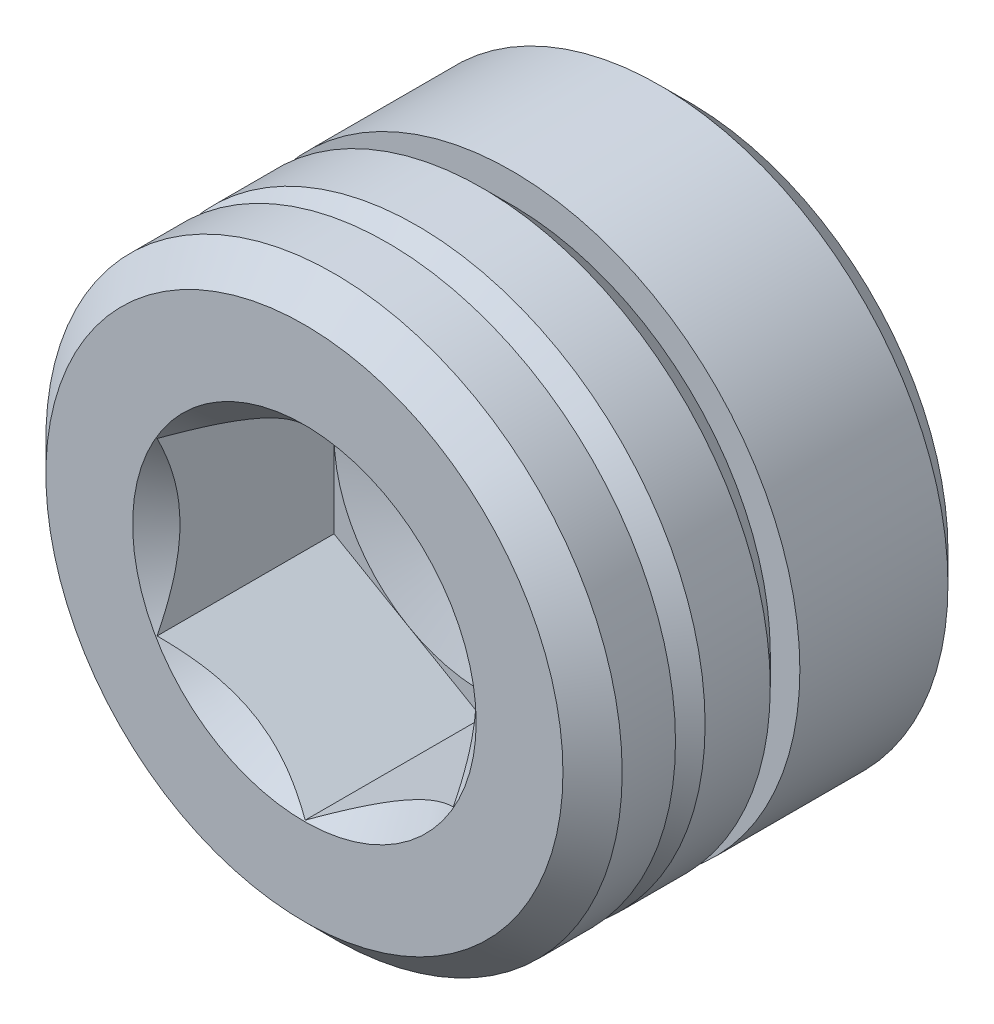
ISO-10303-21;
HEADER;
FILE_DESCRIPTION(('STEP AP214'),'2;1');
FILE_NAME('part.step','',(''),(''),'','','');
FILE_SCHEMA(('AUTOMOTIVE_DESIGN { 1 0 10303 214 1 1 1 1 }'));
ENDSEC;
DATA;
#1=APPLICATION_CONTEXT('core data for automotive mechanical design processes');
#2=APPLICATION_PROTOCOL_DEFINITION('international standard','automotive_design',2000,#1);
#3=PRODUCT_CONTEXT('',#1,'mechanical');
#4=PRODUCT('Part','Part','',(#3));
#5=PRODUCT_RELATED_PRODUCT_CATEGORY('part','',(#4));
#6=PRODUCT_DEFINITION_FORMATION('','',#4);
#7=PRODUCT_DEFINITION_CONTEXT('part definition',#1,'design');
#8=PRODUCT_DEFINITION('design','',#6,#7);
#9=PRODUCT_DEFINITION_SHAPE('','',#8);
#10=(LENGTH_UNIT() NAMED_UNIT(*) SI_UNIT(.MILLI.,.METRE.));
#11=(NAMED_UNIT(*) PLANE_ANGLE_UNIT() SI_UNIT($,.RADIAN.));
#12=(NAMED_UNIT(*) SI_UNIT($,.STERADIAN.) SOLID_ANGLE_UNIT());
#13=UNCERTAINTY_MEASURE_WITH_UNIT(LENGTH_MEASURE(1.E-05),#10,'distance_accuracy_value','');
#14=(GEOMETRIC_REPRESENTATION_CONTEXT(3) GLOBAL_UNCERTAINTY_ASSIGNED_CONTEXT((#13)) GLOBAL_UNIT_ASSIGNED_CONTEXT((#10,
#11,#12)) REPRESENTATION_CONTEXT('',''));
#15=CARTESIAN_POINT('',(0.,0.,0.));
#16=DIRECTION('',(0.,0.,1.));
#17=DIRECTION('',(1.,0.,0.));
#18=AXIS2_PLACEMENT_3D('',#15,#16,#17);
#19=CARTESIAN_POINT('',(0.,0.,-6.5));
#20=DIRECTION('',(0.,0.,1.));
#21=DIRECTION('',(1.,0.,0.));
#22=AXIS2_PLACEMENT_3D('',#19,#20,#21);
#23=CYLINDRICAL_SURFACE('',#22,4.865);
#24=CARTESIAN_POINT('',(0.,0.,-0.5));
#25=DIRECTION('',(0.,0.,1.));
#26=DIRECTION('',(1.,0.,0.));
#27=AXIS2_PLACEMENT_3D('',#24,#25,#26);
#28=CIRCLE('',#27,4.865);
#29=CARTESIAN_POINT('',(4.865,0.,-0.5));
#30=VERTEX_POINT('',#29);
#31=EDGE_CURVE('E42',#30,#30,#28,.T.);
#32=ORIENTED_EDGE('',*,*,#31,.F.);
#33=EDGE_LOOP('',(#32));
#34=FACE_BOUND('',#33,.T.);
#35=CARTESIAN_POINT('',(0.,0.,-1.4));
#36=DIRECTION('',(0.,0.,1.));
#37=DIRECTION('',(1.,0.,0.));
#38=AXIS2_PLACEMENT_3D('',#35,#36,#37);
#39=CIRCLE('',#38,4.865);
#40=CARTESIAN_POINT('',(4.865,0.,-1.4));
#41=VERTEX_POINT('',#40);
#42=EDGE_CURVE('E223',#41,#41,#39,.T.);
#43=ORIENTED_EDGE('',*,*,#42,.T.);
#44=EDGE_LOOP('',(#43));
#45=FACE_BOUND('',#44,.T.);
#46=ADVANCED_FACE('F34',(#34,#45),#23,.T.);
#47=CARTESIAN_POINT('',(0.,0.,0.));
#48=DIRECTION('',(0.,0.,-1.));
#49=DIRECTION('',(-1.,0.,0.));
#50=AXIS2_PLACEMENT_3D('',#47,#48,#49);
#51=PLANE('',#50);
#52=CARTESIAN_POINT('',(0.,0.,0.));
#53=DIRECTION('',(0.,0.,1.));
#54=DIRECTION('',(1.,0.,0.));
#55=AXIS2_PLACEMENT_3D('',#52,#53,#54);
#56=CIRCLE('',#55,2.9);
#57=CARTESIAN_POINT('',(2.9,0.,0.));
#58=VERTEX_POINT('',#57);
#59=EDGE_CURVE('E204',#58,#58,#56,.T.);
#60=ORIENTED_EDGE('',*,*,#59,.F.);
#61=EDGE_LOOP('',(#60));
#62=FACE_BOUND('',#61,.T.);
#63=CARTESIAN_POINT('',(0.,0.,0.));
#64=DIRECTION('',(0.,0.,1.));
#65=DIRECTION('',(1.,0.,0.));
#66=AXIS2_PLACEMENT_3D('',#63,#64,#65);
#67=CIRCLE('',#66,4.365);
#68=CARTESIAN_POINT('',(4.365,0.,0.));
#69=VERTEX_POINT('',#68);
#70=EDGE_CURVE('E11',#69,#69,#67,.T.);
#71=ORIENTED_EDGE('',*,*,#70,.T.);
#72=EDGE_LOOP('',(#71));
#73=FACE_BOUND('',#72,.T.);
#74=ADVANCED_FACE('F36',(#62,#73),#51,.F.);
#75=CARTESIAN_POINT('',(0.,0.,-0.5));
#76=DIRECTION('',(0.,0.,-1.));
#77=DIRECTION('',(-1.,0.,0.));
#78=AXIS2_PLACEMENT_3D('',#75,#76,#77);
#79=CONICAL_SURFACE('',#78,4.865,0.785398163397449);
#80=ORIENTED_EDGE('',*,*,#70,.F.);
#81=EDGE_LOOP('',(#80));
#82=FACE_BOUND('',#81,.T.);
#83=ORIENTED_EDGE('',*,*,#31,.T.);
#84=EDGE_LOOP('',(#83));
#85=FACE_BOUND('',#84,.T.);
#86=ADVANCED_FACE('F234',(#82,#85),#79,.T.);
#87=CARTESIAN_POINT('',(0.,4.865,-1.4));
#88=DIRECTION('',(0.,0.,-1.));
#89=DIRECTION('',(-1.,0.,0.));
#90=AXIS2_PLACEMENT_3D('',#87,#88,#89);
#91=PLANE('',#90);
#92=CARTESIAN_POINT('',(0.,0.,-1.4));
#93=DIRECTION('',(0.,0.,1.));
#94=DIRECTION('',(1.,0.,0.));
#95=AXIS2_PLACEMENT_3D('',#92,#93,#94);
#96=CIRCLE('',#95,4.365);
#97=CARTESIAN_POINT('',(4.365,0.,-1.4));
#98=VERTEX_POINT('',#97);
#99=EDGE_CURVE('E220',#98,#98,#96,.T.);
#100=ORIENTED_EDGE('',*,*,#99,.T.);
#101=EDGE_LOOP('',(#100));
#102=FACE_BOUND('',#101,.T.);
#103=ORIENTED_EDGE('',*,*,#42,.F.);
#104=EDGE_LOOP('',(#103));
#105=FACE_BOUND('',#104,.T.);
#106=ADVANCED_FACE('F243',(#102,#105),#91,.T.);
#107=CARTESIAN_POINT('',(0.,0.,-1.4));
#108=DIRECTION('',(0.,0.,-1.));
#109=DIRECTION('',(-1.,0.,0.));
#110=AXIS2_PLACEMENT_3D('',#107,#108,#109);
#111=CONICAL_SURFACE('',#110,4.365,0.785398163397449);
#112=CARTESIAN_POINT('',(0.,0.,-1.9));
#113=DIRECTION('',(0.,0.,1.));
#114=DIRECTION('',(1.,0.,0.));
#115=AXIS2_PLACEMENT_3D('',#112,#113,#114);
#116=CIRCLE('',#115,4.865);
#117=CARTESIAN_POINT('',(4.865,0.,-1.9));
#118=VERTEX_POINT('',#117);
#119=EDGE_CURVE('E217',#118,#118,#116,.T.);
#120=ORIENTED_EDGE('',*,*,#119,.T.);
#121=EDGE_LOOP('',(#120));
#122=FACE_BOUND('',#121,.T.);
#123=ORIENTED_EDGE('',*,*,#99,.F.);
#124=EDGE_LOOP('',(#123));
#125=FACE_BOUND('',#124,.T.);
#126=ADVANCED_FACE('F245',(#122,#125),#111,.T.);
#127=CARTESIAN_POINT('',(0.,0.,-3.));
#128=DIRECTION('',(0.,0.,1.));
#129=DIRECTION('',(1.,0.,0.));
#130=AXIS2_PLACEMENT_3D('',#127,#128,#129);
#131=CIRCLE('',#130,4.865);
#132=CARTESIAN_POINT('',(4.865,0.,-3.));
#133=VERTEX_POINT('',#132);
#134=EDGE_CURVE('E214',#133,#133,#131,.T.);
#135=ORIENTED_EDGE('',*,*,#134,.T.);
#136=EDGE_LOOP('',(#135));
#137=FACE_BOUND('',#136,.T.);
#138=ORIENTED_EDGE('',*,*,#119,.F.);
#139=EDGE_LOOP('',(#138));
#140=FACE_BOUND('',#139,.T.);
#141=ADVANCED_FACE('F239',(#137,#140),#23,.T.);
#142=CARTESIAN_POINT('',(0.,4.365,-3.5));
#143=DIRECTION('',(0.,0.,1.));
#144=DIRECTION('',(1.,0.,0.));
#145=AXIS2_PLACEMENT_3D('',#142,#143,#144);
#146=PLANE('',#145);
#147=CARTESIAN_POINT('',(0.,0.,-3.5));
#148=DIRECTION('',(0.,0.,1.));
#149=DIRECTION('',(1.,0.,0.));
#150=AXIS2_PLACEMENT_3D('',#147,#148,#149);
#151=CIRCLE('',#150,4.865);
#152=CARTESIAN_POINT('',(4.865,0.,-3.5));
#153=VERTEX_POINT('',#152);
#154=EDGE_CURVE('E208',#153,#153,#151,.T.);
#155=ORIENTED_EDGE('',*,*,#154,.T.);
#156=EDGE_LOOP('',(#155));
#157=FACE_BOUND('',#156,.T.);
#158=CARTESIAN_POINT('',(0.,0.,-3.5));
#159=DIRECTION('',(0.,0.,1.));
#160=DIRECTION('',(1.,0.,0.));
#161=AXIS2_PLACEMENT_3D('',#158,#159,#160);
#162=CIRCLE('',#161,4.365);
#163=CARTESIAN_POINT('',(4.365,0.,-3.5));
#164=VERTEX_POINT('',#163);
#165=EDGE_CURVE('E211',#164,#164,#162,.T.);
#166=ORIENTED_EDGE('',*,*,#165,.F.);
#167=EDGE_LOOP('',(#166));
#168=FACE_BOUND('',#167,.T.);
#169=ADVANCED_FACE('F275',(#157,#168),#146,.T.);
#170=CARTESIAN_POINT('',(0.,0.,-3.));
#171=DIRECTION('',(0.,0.,1.));
#172=DIRECTION('',(1.,0.,0.));
#173=AXIS2_PLACEMENT_3D('',#170,#171,#172);
#174=CONICAL_SURFACE('',#173,4.865,0.785398163397449);
#175=ORIENTED_EDGE('',*,*,#165,.T.);
#176=EDGE_LOOP('',(#175));
#177=FACE_BOUND('',#176,.T.);
#178=ORIENTED_EDGE('',*,*,#134,.F.);
#179=EDGE_LOOP('',(#178));
#180=FACE_BOUND('',#179,.T.);
#181=ADVANCED_FACE('F261',(#177,#180),#174,.T.);
#182=CARTESIAN_POINT('',(0.,4.365,-6.5));
#183=DIRECTION('',(0.,0.,1.));
#184=DIRECTION('',(1.,0.,0.));
#185=AXIS2_PLACEMENT_3D('',#182,#183,#184);
#186=PLANE('',#185);
#187=CARTESIAN_POINT('',(0.,0.,-6.5));
#188=DIRECTION('',(0.,0.,1.));
#189=DIRECTION('',(1.,0.,0.));
#190=AXIS2_PLACEMENT_3D('',#187,#188,#189);
#191=CIRCLE('',#190,4.365);
#192=CARTESIAN_POINT('',(4.365,0.,-6.5));
#193=VERTEX_POINT('',#192);
#194=EDGE_CURVE('E226',#193,#193,#191,.T.);
#195=ORIENTED_EDGE('',*,*,#194,.F.);
#196=EDGE_LOOP('',(#195));
#197=FACE_BOUND('',#196,.T.);
#198=ADVANCED_FACE('F257',(#197),#186,.F.);
#199=CARTESIAN_POINT('',(0.,0.,-6.5));
#200=DIRECTION('',(0.,0.,1.));
#201=DIRECTION('',(1.,0.,0.));
#202=AXIS2_PLACEMENT_3D('',#199,#200,#201);
#203=CONICAL_SURFACE('',#202,4.365,0.785398163397449);
#204=CARTESIAN_POINT('',(0.,0.,-6.));
#205=DIRECTION('',(0.,0.,1.));
#206=DIRECTION('',(1.,0.,0.));
#207=AXIS2_PLACEMENT_3D('',#204,#205,#206);
#208=CIRCLE('',#207,4.865);
#209=CARTESIAN_POINT('',(4.865,0.,-6.));
#210=VERTEX_POINT('',#209);
#211=EDGE_CURVE('E229',#210,#210,#208,.T.);
#212=ORIENTED_EDGE('',*,*,#211,.F.);
#213=EDGE_LOOP('',(#212));
#214=FACE_BOUND('',#213,.T.);
#215=ORIENTED_EDGE('',*,*,#194,.T.);
#216=EDGE_LOOP('',(#215));
#217=FACE_BOUND('',#216,.T.);
#218=ADVANCED_FACE('F260',(#214,#217),#203,.T.);
#219=ORIENTED_EDGE('',*,*,#211,.T.);
#220=EDGE_LOOP('',(#219));
#221=FACE_BOUND('',#220,.T.);
#222=ORIENTED_EDGE('',*,*,#154,.F.);
#223=EDGE_LOOP('',(#222));
#224=FACE_BOUND('',#223,.T.);
#225=ADVANCED_FACE('F240',(#221,#224),#23,.T.);
#226=CARTESIAN_POINT('',(0.,0.,-0.4));
#227=DIRECTION('',(0.,0.,1.));
#228=DIRECTION('',(1.,0.,0.));
#229=AXIS2_PLACEMENT_3D('',#226,#227,#228);
#230=CONICAL_SURFACE('',#229,2.5,0.785398163397448);
#231=CARTESIAN_POINT('',(2.5002,1.44326020292026,-0.0131331770700893));
#232=CARTESIAN_POINT('',(2.41426172221223,1.49287669073472,-0.062707948697128));
#233=CARTESIAN_POINT('',(2.32688643272424,1.54332283764113,-0.109371172689351));
#234=CARTESIAN_POINT('',(2.1487185438344,1.64618811625262,-0.194810514013558));
#235=CARTESIAN_POINT('',(2.05790899931891,1.69861703122362,-0.233539091645859));
#236=CARTESIAN_POINT('',(1.87479587687306,1.80433744175988,-0.299881950154125));
#237=CARTESIAN_POINT('',(1.78253893547064,1.85760201171318,-0.327662985521009));
#238=CARTESIAN_POINT('',(1.59599399122369,1.96530378549012,-0.370465478141201));
#239=CARTESIAN_POINT('',(1.50171168743369,2.01973769896309,-0.385518887380524));
#240=CARTESIAN_POINT('',(1.33922174170812,2.11355131286835,-0.399100931842387));
#241=CARTESIAN_POINT('',(1.27122403211982,2.15280980880343,-0.401111554811067));
#242=CARTESIAN_POINT('',(1.13533975883075,2.23126263056551,-0.397724536864381));
#243=CARTESIAN_POINT('',(1.06745324244773,2.27045692907359,-0.39232429875205));
#244=CARTESIAN_POINT('',(0.932321211763861,2.34847544336506,-0.374422865649399));
#245=CARTESIAN_POINT('',(0.865076500246406,2.38729919566124,-0.36191372700539));
#246=CARTESIAN_POINT('',(0.731749899181766,2.46427534467604,-0.330481152096164));
#247=CARTESIAN_POINT('',(0.665667920900308,2.50242779262543,-0.311558207555053));
#248=CARTESIAN_POINT('',(0.496403653308706,2.60015256308362,-0.255381292643628));
#249=CARTESIAN_POINT('',(0.394270877777084,2.65911894852988,-0.213892822455692));
#250=CARTESIAN_POINT('',(0.244093585059477,2.74582384890656,-0.143854607328799));
#251=CARTESIAN_POINT('',(0.19460346011738,2.7743969858641,-0.119246401935815));
#252=CARTESIAN_POINT('',(0.0965399361611477,2.83101398781791,-0.0677867673366589));
#253=CARTESIAN_POINT('',(0.0479659965030693,2.85905816495511,-0.0409367152725411));
#254=CARTESIAN_POINT('',(-0.000200000000000214,2.88686681600194,-0.0131331770701356));
#255=B_SPLINE_CURVE_WITH_KNOTS('',3,(#231,#232,#233,#234,#235,#236,#237,#238,#239,#240,#241,
#242,#243,#244,#245,#246,#247,#248,#249,#250,#251,#252,#253,#254),.UNSPECIFIED.,.F.,.F.,(4,2,2,
2,2,2,2,2,2,2,2,4),(0.,0.33301208513393,0.667964518301409,0.997597032043317,1.32639954393847,
1.56169424147171,1.79707142102085,2.03271213522173,2.26833478775653,2.64260240809532,
2.82922877818862,3.01574133749021),.UNSPECIFIED.);
#256=CARTESIAN_POINT('',(2.5,1.4433756729741,-0.0132486540518531));
#257=VERTEX_POINT('',#256);
#258=CARTESIAN_POINT('',(0.,2.8867513459481,-0.0132486540519));
#259=VERTEX_POINT('',#258);
#260=EDGE_CURVE('E478',#257,#259,#255,.T.);
#261=ORIENTED_EDGE('',*,*,#260,.F.);
#262=CARTESIAN_POINT('',(2.5,-3.01755698672711,1.01862860809054));
#263=CARTESIAN_POINT('',(2.5,-2.94467480099732,0.962517959419891));
#264=CARTESIAN_POINT('',(2.5,-2.87140052127294,0.906908610297385));
#265=CARTESIAN_POINT('',(2.5,-2.72390729450025,0.796921713998471));
#266=CARTESIAN_POINT('',(2.5,-2.64968812856028,0.742544460667749));
#267=CARTESIAN_POINT('',(2.5,-2.49960234133529,0.63486400368164));
#268=CARTESIAN_POINT('',(2.5,-2.42372742857518,0.581572319008927));
#269=CARTESIAN_POINT('',(2.5,-2.27071587266825,0.476838423141059));
#270=CARTESIAN_POINT('',(2.5,-2.19357931685321,0.4253960847146));
#271=CARTESIAN_POINT('',(2.5,-2.03286176497117,0.321571878570448));
#272=CARTESIAN_POINT('',(2.5,-1.94918366204473,0.269339575524413));
#273=CARTESIAN_POINT('',(2.5,-1.77988701750962,0.168125304722888));
#274=CARTESIAN_POINT('',(2.5,-1.69426873048053,0.119142913808118));
#275=CARTESIAN_POINT('',(2.5,-1.52103010729432,0.0254467757476879));
#276=CARTESIAN_POINT('',(2.5,-1.43341627759486,-0.0192789073600382));
#277=CARTESIAN_POINT('',(2.5,-1.25570853877067,-0.103451302113907));
#278=CARTESIAN_POINT('',(2.5,-1.1656158258591,-0.142900507927059));
#279=CARTESIAN_POINT('',(2.5,-0.99183653622791,-0.211502196122745));
#280=CARTESIAN_POINT('',(2.5,-0.908402638106546,-0.241288250931242));
#281=CARTESIAN_POINT('',(2.5,-0.739404629668206,-0.294182445662333));
#282=CARTESIAN_POINT('',(2.5,-0.653840384437043,-0.317290161473531));
#283=CARTESIAN_POINT('',(2.5,-0.482585667546743,-0.355189850304741));
#284=CARTESIAN_POINT('',(2.5,-0.396929270953566,-0.370133204510761));
#285=CARTESIAN_POINT('',(2.5,-0.224546473226209,-0.391391619790405));
#286=CARTESIAN_POINT('',(2.5,-0.137820299541683,-0.39770848412608));
#287=CARTESIAN_POINT('',(2.5,0.0319957557755689,-0.401173193038338));
#288=CARTESIAN_POINT('',(2.5,0.115077718195651,-0.398712275622634));
#289=CARTESIAN_POINT('',(2.5,0.28059510652013,-0.385656459671616));
#290=CARTESIAN_POINT('',(2.5,0.363030473192649,-0.375060824541121));
#291=CARTESIAN_POINT('',(2.5,0.52805817999491,-0.346156195749019));
#292=CARTESIAN_POINT('',(2.5,0.610626262505323,-0.327710822763318));
#293=CARTESIAN_POINT('',(2.5,0.773934722664069,-0.28412870193578));
#294=CARTESIAN_POINT('',(2.5,0.854675201821975,-0.258992326723009));
#295=CARTESIAN_POINT('',(2.5,1.10294141795223,-0.172090068047425));
#296=CARTESIAN_POINT('',(2.5,1.2671021925792,-0.100680848920713));
#297=CARTESIAN_POINT('',(2.5,1.50736283278926,0.0184433132476623));
#298=CARTESIAN_POINT('',(2.5,1.58660007042279,0.06024544768032));
#299=CARTESIAN_POINT('',(2.5,1.74328132600688,0.147092574739829));
#300=CARTESIAN_POINT('',(2.5,1.82072565590588,0.19213699755));
#301=CARTESIAN_POINT('',(2.5,1.97024569361975,0.282530677171682));
#302=CARTESIAN_POINT('',(2.5,2.04239770835829,0.327755136218187));
#303=CARTESIAN_POINT('',(2.5,2.18546367646082,0.420130926378547));
#304=CARTESIAN_POINT('',(2.5,2.25637753646808,0.467282401901416));
#305=CARTESIAN_POINT('',(2.5,2.39655741321448,0.562783743747668));
#306=CARTESIAN_POINT('',(2.5,2.46583208730654,0.611120955220319));
#307=CARTESIAN_POINT('',(2.5,2.60343097037792,0.709091677176423));
#308=CARTESIAN_POINT('',(2.5,2.67175543611524,0.758724826624572));
#309=CARTESIAN_POINT('',(2.5,2.73968148121383,0.808888596130387));
#310=B_SPLINE_CURVE_WITH_KNOTS('',3,(#262,#263,#264,#265,#266,#267,#268,#269,#270,#271,#272,
#273,#274,#275,#276,#277,#278,#279,#280,#281,#282,#283,#284,#285,#286,#287,#288,#289,#290,#291,
#292,#293,#294,#295,#296,#297,#298,#299,#300,#301,#302,#303,#304,#305,#306,#307,#308,#309),
.UNSPECIFIED.,.F.,.F.,(4,2,2,2,2,2,2,2,2,2,2,2,2,2,2,2,2,2,2,2,2,2,2,4),(0.,0.275943374942262,
0.551951881998573,0.830089230356277,1.10820740666027,1.40407514318273,1.69990427992987,
1.99487782562456,2.28971144213853,2.55525654288693,2.82081850351157,3.08127318840113,
3.34167342009059,3.59061511682889,3.83957935778947,4.09305796199127,4.34652245265104,
4.88192415754218,5.15066436530966,5.41935745804677,5.67478760557292,5.93023693004823,
6.18363611951778,6.43696545228341),.UNSPECIFIED.);
#311=CARTESIAN_POINT('',(2.5,-1.4433756729741,-0.0132486540518531));
#312=VERTEX_POINT('',#311);
#313=EDGE_CURVE('E482',#312,#257,#310,.T.);
#314=ORIENTED_EDGE('',*,*,#313,.F.);
#315=CARTESIAN_POINT('',(-0.000200000000000038,-2.88686681600194,-0.0131331770701359));
#316=CARTESIAN_POINT('',(0.0857382777877621,-2.83725032818748,-0.0627079486971693));
#317=CARTESIAN_POINT('',(0.173113567275748,-2.78680418128108,-0.109371172689387));
#318=CARTESIAN_POINT('',(0.351281456165578,-2.68393890266959,-0.194810514013586));
#319=CARTESIAN_POINT('',(0.442091000681061,-2.63150998769859,-0.233539091645882));
#320=CARTESIAN_POINT('',(0.625204123126901,-2.52578957716234,-0.29988195015414));
#321=CARTESIAN_POINT('',(0.717461064529317,-2.47252500720904,-0.327662985521019));
#322=CARTESIAN_POINT('',(0.904006008776257,-2.36482323343211,-0.370465478141206));
#323=CARTESIAN_POINT('',(0.998288312566251,-2.31038931995914,-0.385518887380527));
#324=CARTESIAN_POINT('',(1.16077825829181,-2.21657570605389,-0.399100931842388));
#325=CARTESIAN_POINT('',(1.22877596788012,-2.1773172101188,-0.401111554811067));
#326=CARTESIAN_POINT('',(1.36466024116918,-2.09886438835673,-0.39772453686438));
#327=CARTESIAN_POINT('',(1.4325467575522,-2.05967008984865,-0.392324298752048));
#328=CARTESIAN_POINT('',(1.56767878823607,-1.98165157555718,-0.374422865649397));
#329=CARTESIAN_POINT('',(1.63492349975353,-1.942827823261,-0.361913727005388));
#330=CARTESIAN_POINT('',(1.76825010081817,-1.86585167424619,-0.330481152096161));
#331=CARTESIAN_POINT('',(1.83433207909962,-1.82769922629681,-0.31155820755505));
#332=CARTESIAN_POINT('',(2.00359634669124,-1.72997445583861,-0.25538129264362));
#333=CARTESIAN_POINT('',(2.10572912222287,-1.67100807039235,-0.213892822455677));
#334=CARTESIAN_POINT('',(2.2559064149405,-1.58430317001566,-0.143854607328772));
#335=CARTESIAN_POINT('',(2.3053965398826,-1.55573003305811,-0.119246401935785));
#336=CARTESIAN_POINT('',(2.40346006383884,-1.49911303110429,-0.0677867673366203));
#337=CARTESIAN_POINT('',(2.45203400349693,-1.4710688539671,-0.0409367152724984));
#338=CARTESIAN_POINT('',(2.5002,-1.44326020292026,-0.0131331770700891));
#339=B_SPLINE_CURVE_WITH_KNOTS('',3,(#315,#316,#317,#318,#319,#320,#321,#322,#323,#324,#325,
#326,#327,#328,#329,#330,#331,#332,#333,#334,#335,#336,#337,#338),.UNSPECIFIED.,.F.,.F.,(4,2,2,
2,2,2,2,2,2,2,2,4),(0.,0.333012085133908,0.667964518301366,0.997597032043252,1.32639954393838,
1.56169424147162,1.79707142102076,2.03271213522164,2.26833478775644,2.64260240809528,
2.82922877818859,3.01574133749021),.UNSPECIFIED.);
#340=CARTESIAN_POINT('',(0.,-2.8867513459481,-0.0132486540519));
#341=VERTEX_POINT('',#340);
#342=EDGE_CURVE('E167',#341,#312,#339,.T.);
#343=ORIENTED_EDGE('',*,*,#342,.F.);
#344=CARTESIAN_POINT('',(-2.5002,-1.44326020292026,-0.0131331770700893));
#345=CARTESIAN_POINT('',(-2.41426172221223,-1.49287669073472,-0.062707948697128));
#346=CARTESIAN_POINT('',(-2.32688643272424,-1.54332283764113,-0.109371172689351));
#347=CARTESIAN_POINT('',(-2.1487185438344,-1.64618811625262,-0.194810514013558));
#348=CARTESIAN_POINT('',(-2.05790899931891,-1.69861703122362,-0.233539091645859));
#349=CARTESIAN_POINT('',(-1.87479587687306,-1.80433744175988,-0.299881950154125));
#350=CARTESIAN_POINT('',(-1.78253893547064,-1.85760201171318,-0.327662985521009));
#351=CARTESIAN_POINT('',(-1.59599399122369,-1.96530378549012,-0.370465478141201));
#352=CARTESIAN_POINT('',(-1.50171168743369,-2.01973769896309,-0.385518887380524));
#353=CARTESIAN_POINT('',(-1.33922174170812,-2.11355131286835,-0.399100931842387));
#354=CARTESIAN_POINT('',(-1.27122403211982,-2.15280980880343,-0.401111554811067));
#355=CARTESIAN_POINT('',(-1.13533975883075,-2.23126263056551,-0.397724536864381));
#356=CARTESIAN_POINT('',(-1.06745324244773,-2.27045692907359,-0.39232429875205));
#357=CARTESIAN_POINT('',(-0.932321211763861,-2.34847544336506,-0.374422865649399));
#358=CARTESIAN_POINT('',(-0.865076500246406,-2.38729919566124,-0.36191372700539));
#359=CARTESIAN_POINT('',(-0.731749899181766,-2.46427534467604,-0.330481152096164));
#360=CARTESIAN_POINT('',(-0.665667920900308,-2.50242779262543,-0.311558207555053));
#361=CARTESIAN_POINT('',(-0.496403653308706,-2.60015256308362,-0.255381292643628));
#362=CARTESIAN_POINT('',(-0.394270877777084,-2.65911894852988,-0.213892822455692));
#363=CARTESIAN_POINT('',(-0.244093585059477,-2.74582384890656,-0.143854607328799));
#364=CARTESIAN_POINT('',(-0.19460346011738,-2.7743969858641,-0.119246401935815));
#365=CARTESIAN_POINT('',(-0.0965399361611477,-2.83101398781791,-0.0677867673366589));
#366=CARTESIAN_POINT('',(-0.0479659965030693,-2.85905816495511,-0.0409367152725411));
#367=CARTESIAN_POINT('',(0.000200000000000214,-2.88686681600194,-0.0131331770701356));
#368=B_SPLINE_CURVE_WITH_KNOTS('',3,(#344,#345,#346,#347,#348,#349,#350,#351,#352,#353,#354,
#355,#356,#357,#358,#359,#360,#361,#362,#363,#364,#365,#366,#367),.UNSPECIFIED.,.F.,.F.,(4,2,2,
2,2,2,2,2,2,2,2,4),(0.,0.33301208513393,0.667964518301409,0.997597032043317,1.32639954393847,
1.56169424147171,1.79707142102085,2.03271213522173,2.26833478775653,2.64260240809532,
2.82922877818862,3.01574133749021),.UNSPECIFIED.);
#369=CARTESIAN_POINT('',(-2.5,-1.4433756729741,-0.0132486540518531));
#370=VERTEX_POINT('',#369);
#371=EDGE_CURVE('E149',#370,#341,#368,.T.);
#372=ORIENTED_EDGE('',*,*,#371,.F.);
#373=CARTESIAN_POINT('',(-2.5,-3.01755698672711,1.01862860809054));
#374=CARTESIAN_POINT('',(-2.5,-2.94467480099732,0.962517959419891));
#375=CARTESIAN_POINT('',(-2.5,-2.87140052127294,0.906908610297385));
#376=CARTESIAN_POINT('',(-2.5,-2.72390729450025,0.796921713998471));
#377=CARTESIAN_POINT('',(-2.5,-2.64968812856028,0.742544460667749));
#378=CARTESIAN_POINT('',(-2.5,-2.49960234133529,0.63486400368164));
#379=CARTESIAN_POINT('',(-2.5,-2.42372742857518,0.581572319008927));
#380=CARTESIAN_POINT('',(-2.5,-2.27071587266825,0.476838423141059));
#381=CARTESIAN_POINT('',(-2.5,-2.19357931685321,0.4253960847146));
#382=CARTESIAN_POINT('',(-2.5,-2.03286176497117,0.321571878570448));
#383=CARTESIAN_POINT('',(-2.5,-1.94918366204473,0.269339575524413));
#384=CARTESIAN_POINT('',(-2.5,-1.77988701750962,0.168125304722888));
#385=CARTESIAN_POINT('',(-2.5,-1.69426873048053,0.119142913808118));
#386=CARTESIAN_POINT('',(-2.5,-1.52103010729432,0.0254467757476879));
#387=CARTESIAN_POINT('',(-2.5,-1.43341627759486,-0.0192789073600382));
#388=CARTESIAN_POINT('',(-2.5,-1.25570853877067,-0.103451302113907));
#389=CARTESIAN_POINT('',(-2.5,-1.1656158258591,-0.142900507927059));
#390=CARTESIAN_POINT('',(-2.5,-0.99183653622791,-0.211502196122745));
#391=CARTESIAN_POINT('',(-2.5,-0.908402638106546,-0.241288250931242));
#392=CARTESIAN_POINT('',(-2.5,-0.739404629668206,-0.294182445662333));
#393=CARTESIAN_POINT('',(-2.5,-0.653840384437043,-0.317290161473531));
#394=CARTESIAN_POINT('',(-2.5,-0.482585667546743,-0.355189850304741));
#395=CARTESIAN_POINT('',(-2.5,-0.396929270953566,-0.370133204510761));
#396=CARTESIAN_POINT('',(-2.5,-0.224546473226209,-0.391391619790405));
#397=CARTESIAN_POINT('',(-2.5,-0.137820299541683,-0.39770848412608));
#398=CARTESIAN_POINT('',(-2.5,0.0319957557755689,-0.401173193038338));
#399=CARTESIAN_POINT('',(-2.5,0.115077718195651,-0.398712275622634));
#400=CARTESIAN_POINT('',(-2.5,0.28059510652013,-0.385656459671616));
#401=CARTESIAN_POINT('',(-2.5,0.363030473192649,-0.375060824541121));
#402=CARTESIAN_POINT('',(-2.5,0.52805817999491,-0.346156195749019));
#403=CARTESIAN_POINT('',(-2.5,0.610626262505323,-0.327710822763318));
#404=CARTESIAN_POINT('',(-2.5,0.773934722664069,-0.28412870193578));
#405=CARTESIAN_POINT('',(-2.5,0.854675201821975,-0.258992326723009));
#406=CARTESIAN_POINT('',(-2.5,1.10294141795223,-0.172090068047425));
#407=CARTESIAN_POINT('',(-2.5,1.2671021925792,-0.100680848920713));
#408=CARTESIAN_POINT('',(-2.5,1.50736283278926,0.0184433132476623));
#409=CARTESIAN_POINT('',(-2.5,1.58660007042279,0.06024544768032));
#410=CARTESIAN_POINT('',(-2.5,1.74328132600688,0.147092574739829));
#411=CARTESIAN_POINT('',(-2.5,1.82072565590588,0.19213699755));
#412=CARTESIAN_POINT('',(-2.5,1.97024569361975,0.282530677171682));
#413=CARTESIAN_POINT('',(-2.5,2.04239770835829,0.327755136218187));
#414=CARTESIAN_POINT('',(-2.5,2.18546367646082,0.420130926378547));
#415=CARTESIAN_POINT('',(-2.5,2.25637753646808,0.467282401901416));
#416=CARTESIAN_POINT('',(-2.5,2.39655741321448,0.562783743747668));
#417=CARTESIAN_POINT('',(-2.5,2.46583208730654,0.611120955220319));
#418=CARTESIAN_POINT('',(-2.5,2.60343097037792,0.709091677176423));
#419=CARTESIAN_POINT('',(-2.5,2.67175543611524,0.758724826624572));
#420=CARTESIAN_POINT('',(-2.5,2.73968148121383,0.808888596130387));
#421=B_SPLINE_CURVE_WITH_KNOTS('',3,(#373,#374,#375,#376,#377,#378,#379,#380,#381,#382,#383,
#384,#385,#386,#387,#388,#389,#390,#391,#392,#393,#394,#395,#396,#397,#398,#399,#400,#401,#402,
#403,#404,#405,#406,#407,#408,#409,#410,#411,#412,#413,#414,#415,#416,#417,#418,#419,#420),
.UNSPECIFIED.,.F.,.F.,(4,2,2,2,2,2,2,2,2,2,2,2,2,2,2,2,2,2,2,2,2,2,2,4),(0.,0.275943374942262,
0.551951881998573,0.830089230356277,1.10820740666027,1.40407514318273,1.69990427992987,
1.99487782562456,2.28971144213853,2.55525654288693,2.82081850351157,3.08127318840113,
3.34167342009059,3.59061511682889,3.83957935778947,4.09305796199127,4.34652245265104,
4.88192415754218,5.15066436530966,5.41935745804677,5.67478760557292,5.93023693004823,
6.18363611951778,6.43696545228341),.UNSPECIFIED.);
#422=CARTESIAN_POINT('',(-2.5,1.4433756729741,-0.0132486540518531));
#423=VERTEX_POINT('',#422);
#424=EDGE_CURVE('E122',#423,#370,#421,.F.);
#425=ORIENTED_EDGE('',*,*,#424,.F.);
#426=CARTESIAN_POINT('',(0.000200000000000038,2.88686681600194,-0.0131331770701359));
#427=CARTESIAN_POINT('',(-0.0857382777877621,2.83725032818748,-0.0627079486971693));
#428=CARTESIAN_POINT('',(-0.173113567275748,2.78680418128108,-0.109371172689387));
#429=CARTESIAN_POINT('',(-0.351281456165578,2.68393890266959,-0.194810514013586));
#430=CARTESIAN_POINT('',(-0.442091000681061,2.63150998769859,-0.233539091645882));
#431=CARTESIAN_POINT('',(-0.625204123126901,2.52578957716234,-0.29988195015414));
#432=CARTESIAN_POINT('',(-0.717461064529317,2.47252500720904,-0.327662985521019));
#433=CARTESIAN_POINT('',(-0.904006008776257,2.36482323343211,-0.370465478141206));
#434=CARTESIAN_POINT('',(-0.998288312566251,2.31038931995914,-0.385518887380527));
#435=CARTESIAN_POINT('',(-1.16077825829181,2.21657570605389,-0.399100931842388));
#436=CARTESIAN_POINT('',(-1.22877596788012,2.1773172101188,-0.401111554811067));
#437=CARTESIAN_POINT('',(-1.36466024116918,2.09886438835673,-0.39772453686438));
#438=CARTESIAN_POINT('',(-1.4325467575522,2.05967008984865,-0.392324298752048));
#439=CARTESIAN_POINT('',(-1.56767878823607,1.98165157555718,-0.374422865649397));
#440=CARTESIAN_POINT('',(-1.63492349975353,1.942827823261,-0.361913727005388));
#441=CARTESIAN_POINT('',(-1.76825010081817,1.86585167424619,-0.330481152096161));
#442=CARTESIAN_POINT('',(-1.83433207909962,1.82769922629681,-0.31155820755505));
#443=CARTESIAN_POINT('',(-2.00359634669124,1.72997445583861,-0.25538129264362));
#444=CARTESIAN_POINT('',(-2.10572912222287,1.67100807039235,-0.213892822455677));
#445=CARTESIAN_POINT('',(-2.2559064149405,1.58430317001566,-0.143854607328772));
#446=CARTESIAN_POINT('',(-2.3053965398826,1.55573003305811,-0.119246401935785));
#447=CARTESIAN_POINT('',(-2.40346006383884,1.49911303110429,-0.0677867673366203));
#448=CARTESIAN_POINT('',(-2.45203400349693,1.4710688539671,-0.0409367152724984));
#449=CARTESIAN_POINT('',(-2.5002,1.44326020292026,-0.0131331770700891));
#450=B_SPLINE_CURVE_WITH_KNOTS('',3,(#426,#427,#428,#429,#430,#431,#432,#433,#434,#435,#436,
#437,#438,#439,#440,#441,#442,#443,#444,#445,#446,#447,#448,#449),.UNSPECIFIED.,.F.,.F.,(4,2,2,
2,2,2,2,2,2,2,2,4),(0.,0.333012085133908,0.667964518301366,0.997597032043252,1.32639954393838,
1.56169424147162,1.79707142102076,2.03271213522164,2.26833478775644,2.64260240809528,
2.82922877818859,3.01574133749021),.UNSPECIFIED.);
#451=EDGE_CURVE('E195',#259,#423,#450,.T.);
#452=ORIENTED_EDGE('',*,*,#451,.F.);
#453=EDGE_LOOP('',(#261,#314,#343,#372,#425,#452));
#454=FACE_BOUND('',#453,.T.);
#455=ORIENTED_EDGE('',*,*,#59,.T.);
#456=EDGE_LOOP('',(#455));
#457=FACE_BOUND('',#456,.T.);
#458=ADVANCED_FACE('F173',(#454,#457),#230,.F.);
#459=CARTESIAN_POINT('',(-2.5,1.4433756729741,-3.));
#460=DIRECTION('',(-1.,0.,0.));
#461=DIRECTION('',(0.,0.,1.));
#462=AXIS2_PLACEMENT_3D('',#459,#460,#461);
#463=PLANE('',#462);
#464=ORIENTED_EDGE('',*,*,#424,.T.);
#465=DIRECTION('',(0.,0.,1.));
#466=VECTOR('',#465,1.);
#467=CARTESIAN_POINT('',(-2.5,-1.4433756729741,-3.));
#468=LINE('',#467,#466);
#469=CARTESIAN_POINT('',(-2.5,-1.4433756729741,-3.));
#470=VERTEX_POINT('',#469);
#471=EDGE_CURVE('E118',#470,#370,#468,.T.);
#472=ORIENTED_EDGE('',*,*,#471,.F.);
#473=DIRECTION('',(0.,-1.,0.));
#474=VECTOR('',#473,1.);
#475=CARTESIAN_POINT('',(-2.5,1.4433756729741,-3.));
#476=LINE('',#475,#474);
#477=CARTESIAN_POINT('',(-2.5,0.,-3.));
#478=VERTEX_POINT('',#477);
#479=EDGE_CURVE('E105',#478,#470,#476,.T.);
#480=ORIENTED_EDGE('',*,*,#479,.F.);
#481=CARTESIAN_POINT('',(-2.5,1.4433756729741,-3.));
#482=VERTEX_POINT('',#481);
#483=EDGE_CURVE('E115',#482,#478,#476,.T.);
#484=ORIENTED_EDGE('',*,*,#483,.F.);
#485=DIRECTION('',(0.,0.,1.));
#486=VECTOR('',#485,1.);
#487=CARTESIAN_POINT('',(-2.5,1.4433756729741,-3.));
#488=LINE('',#487,#486);
#489=EDGE_CURVE('E147',#482,#423,#488,.T.);
#490=ORIENTED_EDGE('',*,*,#489,.T.);
#491=EDGE_LOOP('',(#464,#472,#480,#484,#490));
#492=FACE_BOUND('',#491,.T.);
#493=ADVANCED_FACE('F119',(#492),#463,.F.);
#494=CARTESIAN_POINT('',(0.,2.8867513459481,-3.));
#495=DIRECTION('',(-0.499999999999983,0.866025403784448,0.));
#496=DIRECTION('',(-0.866025403784448,-0.499999999999983,0.));
#497=AXIS2_PLACEMENT_3D('',#494,#495,#496);
#498=PLANE('',#497);
#499=ORIENTED_EDGE('',*,*,#451,.T.);
#500=ORIENTED_EDGE('',*,*,#489,.F.);
#501=DIRECTION('',(-0.866025403784448,-0.499999999999983,0.));
#502=VECTOR('',#501,1.);
#503=CARTESIAN_POINT('',(0.,2.8867513459481,-3.));
#504=LINE('',#503,#502);
#505=CARTESIAN_POINT('',(-1.24999999999996,2.16506350946112,-3.));
#506=VERTEX_POINT('',#505);
#507=EDGE_CURVE('E144',#506,#482,#504,.T.);
#508=ORIENTED_EDGE('',*,*,#507,.F.);
#509=CARTESIAN_POINT('',(0.,2.8867513459481,-3.));
#510=VERTEX_POINT('',#509);
#511=EDGE_CURVE('E126',#510,#506,#504,.T.);
#512=ORIENTED_EDGE('',*,*,#511,.F.);
#513=DIRECTION('',(0.,0.,1.));
#514=VECTOR('',#513,1.);
#515=CARTESIAN_POINT('',(0.,2.8867513459481,-3.));
#516=LINE('',#515,#514);
#517=EDGE_CURVE('E150',#510,#259,#516,.T.);
#518=ORIENTED_EDGE('',*,*,#517,.T.);
#519=EDGE_LOOP('',(#499,#500,#508,#512,#518));
#520=FACE_BOUND('',#519,.T.);
#521=ADVANCED_FACE('F186',(#520),#498,.F.);
#522=CARTESIAN_POINT('',(2.5,1.4433756729741,-3.));
#523=DIRECTION('',(0.499999999999983,0.866025403784448,0.));
#524=DIRECTION('',(-0.866025403784448,0.499999999999983,0.));
#525=AXIS2_PLACEMENT_3D('',#522,#523,#524);
#526=PLANE('',#525);
#527=ORIENTED_EDGE('',*,*,#260,.T.);
#528=ORIENTED_EDGE('',*,*,#517,.F.);
#529=DIRECTION('',(-0.866025403784448,0.499999999999983,0.));
#530=VECTOR('',#529,1.);
#531=CARTESIAN_POINT('',(2.5,1.4433756729741,-3.));
#532=LINE('',#531,#530);
#533=CARTESIAN_POINT('',(1.24999999999996,2.16506350946112,-3.));
#534=VERTEX_POINT('',#533);
#535=EDGE_CURVE('E140',#534,#510,#532,.T.);
#536=ORIENTED_EDGE('',*,*,#535,.F.);
#537=CARTESIAN_POINT('',(2.5,1.4433756729741,-3.));
#538=VERTEX_POINT('',#537);
#539=EDGE_CURVE('E141',#538,#534,#532,.T.);
#540=ORIENTED_EDGE('',*,*,#539,.F.);
#541=DIRECTION('',(0.,0.,1.));
#542=VECTOR('',#541,1.);
#543=CARTESIAN_POINT('',(2.5,1.4433756729741,-3.));
#544=LINE('',#543,#542);
#545=EDGE_CURVE('E153',#538,#257,#544,.T.);
#546=ORIENTED_EDGE('',*,*,#545,.T.);
#547=EDGE_LOOP('',(#527,#528,#536,#540,#546));
#548=FACE_BOUND('',#547,.T.);
#549=ADVANCED_FACE('F362',(#548),#526,.F.);
#550=CARTESIAN_POINT('',(2.5,-1.4433756729741,-3.));
#551=DIRECTION('',(1.,0.,0.));
#552=DIRECTION('',(0.,0.,-1.));
#553=AXIS2_PLACEMENT_3D('',#550,#551,#552);
#554=PLANE('',#553);
#555=ORIENTED_EDGE('',*,*,#313,.T.);
#556=ORIENTED_EDGE('',*,*,#545,.F.);
#557=DIRECTION('',(0.,1.,0.));
#558=VECTOR('',#557,1.);
#559=CARTESIAN_POINT('',(2.5,-1.4433756729741,-3.));
#560=LINE('',#559,#558);
#561=CARTESIAN_POINT('',(2.5,0.,-3.));
#562=VERTEX_POINT('',#561);
#563=EDGE_CURVE('E138',#562,#538,#560,.T.);
#564=ORIENTED_EDGE('',*,*,#563,.F.);
#565=CARTESIAN_POINT('',(2.5,-1.4433756729741,-3.));
#566=VERTEX_POINT('',#565);
#567=EDGE_CURVE('E49',#566,#562,#560,.T.);
#568=ORIENTED_EDGE('',*,*,#567,.F.);
#569=DIRECTION('',(0.,0.,1.));
#570=VECTOR('',#569,1.);
#571=CARTESIAN_POINT('',(2.5,-1.4433756729741,-3.));
#572=LINE('',#571,#570);
#573=EDGE_CURVE('E156',#566,#312,#572,.T.);
#574=ORIENTED_EDGE('',*,*,#573,.T.);
#575=EDGE_LOOP('',(#555,#556,#564,#568,#574));
#576=FACE_BOUND('',#575,.T.);
#577=ADVANCED_FACE('F370',(#576),#554,.F.);
#578=CARTESIAN_POINT('',(0.,-2.8867513459481,-3.));
#579=DIRECTION('',(0.499999999999983,-0.866025403784448,0.));
#580=DIRECTION('',(0.866025403784448,0.499999999999983,0.));
#581=AXIS2_PLACEMENT_3D('',#578,#579,#580);
#582=PLANE('',#581);
#583=ORIENTED_EDGE('',*,*,#342,.T.);
#584=ORIENTED_EDGE('',*,*,#573,.F.);
#585=DIRECTION('',(0.866025403784448,0.499999999999983,0.));
#586=VECTOR('',#585,1.);
#587=CARTESIAN_POINT('',(0.,-2.8867513459481,-3.));
#588=LINE('',#587,#586);
#589=CARTESIAN_POINT('',(1.24999999999996,-2.16506350946112,-3.));
#590=VERTEX_POINT('',#589);
#591=EDGE_CURVE('E132',#590,#566,#588,.T.);
#592=ORIENTED_EDGE('',*,*,#591,.F.);
#593=CARTESIAN_POINT('',(0.,-2.8867513459481,-3.));
#594=VERTEX_POINT('',#593);
#595=EDGE_CURVE('E134',#594,#590,#588,.T.);
#596=ORIENTED_EDGE('',*,*,#595,.F.);
#597=DIRECTION('',(0.,0.,1.));
#598=VECTOR('',#597,1.);
#599=CARTESIAN_POINT('',(0.,-2.8867513459481,-3.));
#600=LINE('',#599,#598);
#601=EDGE_CURVE('E125',#594,#341,#600,.T.);
#602=ORIENTED_EDGE('',*,*,#601,.T.);
#603=EDGE_LOOP('',(#583,#584,#592,#596,#602));
#604=FACE_BOUND('',#603,.T.);
#605=ADVANCED_FACE('F181',(#604),#582,.F.);
#606=CARTESIAN_POINT('',(-2.5,-1.4433756729741,-3.));
#607=DIRECTION('',(-0.499999999999983,-0.866025403784448,0.));
#608=DIRECTION('',(0.866025403784448,-0.499999999999983,0.));
#609=AXIS2_PLACEMENT_3D('',#606,#607,#608);
#610=PLANE('',#609);
#611=ORIENTED_EDGE('',*,*,#371,.T.);
#612=ORIENTED_EDGE('',*,*,#601,.F.);
#613=DIRECTION('',(0.866025403784448,-0.499999999999983,0.));
#614=VECTOR('',#613,1.);
#615=CARTESIAN_POINT('',(-2.5,-1.4433756729741,-3.));
#616=LINE('',#615,#614);
#617=CARTESIAN_POINT('',(-1.24999999999996,-2.16506350946112,-3.));
#618=VERTEX_POINT('',#617);
#619=EDGE_CURVE('E131',#618,#594,#616,.T.);
#620=ORIENTED_EDGE('',*,*,#619,.F.);
#621=EDGE_CURVE('E109',#470,#618,#616,.T.);
#622=ORIENTED_EDGE('',*,*,#621,.F.);
#623=ORIENTED_EDGE('',*,*,#471,.T.);
#624=EDGE_LOOP('',(#611,#612,#620,#622,#623));
#625=FACE_BOUND('',#624,.T.);
#626=ADVANCED_FACE('F129',(#625),#610,.F.);
#627=CARTESIAN_POINT('',(0.,0.,-3.));
#628=DIRECTION('',(0.,0.,1.));
#629=DIRECTION('',(1.,0.,0.));
#630=AXIS2_PLACEMENT_3D('',#627,#628,#629);
#631=PLANE('',#630);
#632=ORIENTED_EDGE('',*,*,#563,.T.);
#633=ORIENTED_EDGE('',*,*,#539,.T.);
#634=CARTESIAN_POINT('',(0.,0.,-3.));
#635=DIRECTION('',(0.,0.,1.));
#636=DIRECTION('',(1.,0.,0.));
#637=AXIS2_PLACEMENT_3D('',#634,#635,#636);
#638=CIRCLE('',#637,2.5);
#639=EDGE_CURVE('E201',#562,#534,#638,.T.);
#640=ORIENTED_EDGE('',*,*,#639,.F.);
#641=EDGE_LOOP('',(#632,#633,#640));
#642=FACE_BOUND('',#641,.T.);
#643=ADVANCED_FACE('F180',(#642),#631,.T.);
#644=ORIENTED_EDGE('',*,*,#535,.T.);
#645=ORIENTED_EDGE('',*,*,#511,.T.);
#646=EDGE_CURVE('E205',#534,#506,#638,.T.);
#647=ORIENTED_EDGE('',*,*,#646,.F.);
#648=EDGE_LOOP('',(#644,#645,#647));
#649=FACE_BOUND('',#648,.T.);
#650=ADVANCED_FACE('F398',(#649),#631,.T.);
#651=ORIENTED_EDGE('',*,*,#507,.T.);
#652=ORIENTED_EDGE('',*,*,#483,.T.);
#653=EDGE_CURVE('E502',#506,#478,#638,.T.);
#654=ORIENTED_EDGE('',*,*,#653,.F.);
#655=EDGE_LOOP('',(#651,#652,#654));
#656=FACE_BOUND('',#655,.T.);
#657=ADVANCED_FACE('F407',(#656),#631,.T.);
#658=ORIENTED_EDGE('',*,*,#479,.T.);
#659=ORIENTED_EDGE('',*,*,#621,.T.);
#660=EDGE_CURVE('E111',#478,#618,#638,.T.);
#661=ORIENTED_EDGE('',*,*,#660,.F.);
#662=EDGE_LOOP('',(#658,#659,#661));
#663=FACE_BOUND('',#662,.T.);
#664=ADVANCED_FACE('F107',(#663),#631,.T.);
#665=ORIENTED_EDGE('',*,*,#619,.T.);
#666=ORIENTED_EDGE('',*,*,#595,.T.);
#667=EDGE_CURVE('E505',#618,#590,#638,.T.);
#668=ORIENTED_EDGE('',*,*,#667,.F.);
#669=EDGE_LOOP('',(#665,#666,#668));
#670=FACE_BOUND('',#669,.T.);
#671=ADVANCED_FACE('F422',(#670),#631,.T.);
#672=ORIENTED_EDGE('',*,*,#591,.T.);
#673=ORIENTED_EDGE('',*,*,#567,.T.);
#674=EDGE_CURVE('E194',#590,#562,#638,.T.);
#675=ORIENTED_EDGE('',*,*,#674,.F.);
#676=EDGE_LOOP('',(#672,#673,#675));
#677=FACE_BOUND('',#676,.T.);
#678=ADVANCED_FACE('F349',(#677),#631,.T.);
#679=CARTESIAN_POINT('',(0.,0.,-3.6933113601496));
#680=DIRECTION('',(0.,0.,1.));
#681=DIRECTION('',(1.,0.,0.));
#682=AXIS2_PLACEMENT_3D('',#679,#680,#681);
#683=CONICAL_SURFACE('',#682,0.,1.30027029273577);
#684=ORIENTED_EDGE('',*,*,#639,.T.);
#685=ORIENTED_EDGE('',*,*,#646,.T.);
#686=ORIENTED_EDGE('',*,*,#653,.T.);
#687=ORIENTED_EDGE('',*,*,#660,.T.);
#688=ORIENTED_EDGE('',*,*,#667,.T.);
#689=ORIENTED_EDGE('',*,*,#674,.T.);
#690=EDGE_LOOP('',(#684,#685,#686,#687,#688,#689));
#691=FACE_BOUND('',#690,.T.);
#692=CARTESIAN_POINT('',(0.,0.,-3.6933113601496));
#693=VERTEX_POINT('',#692);
#694=VERTEX_LOOP('',#693);
#695=FACE_BOUND('',#694,.T.);
#696=ADVANCED_FACE('F187',(#691,#695),#683,.F.);
#697=CLOSED_SHELL('',(#46,#74,#86,#106,#126,#141,#169,#181,#198,#218,#225,#458,#493,#521,#549,
#577,#605,#626,#643,#650,#657,#664,#671,#678,#696));
#698=MANIFOLD_SOLID_BREP('B2',#697);
#699=ADVANCED_BREP_SHAPE_REPRESENTATION('',(#18,#698),#14);
#700=SHAPE_DEFINITION_REPRESENTATION(#9,#699);
ENDSEC;
END-ISO-10303-21;
